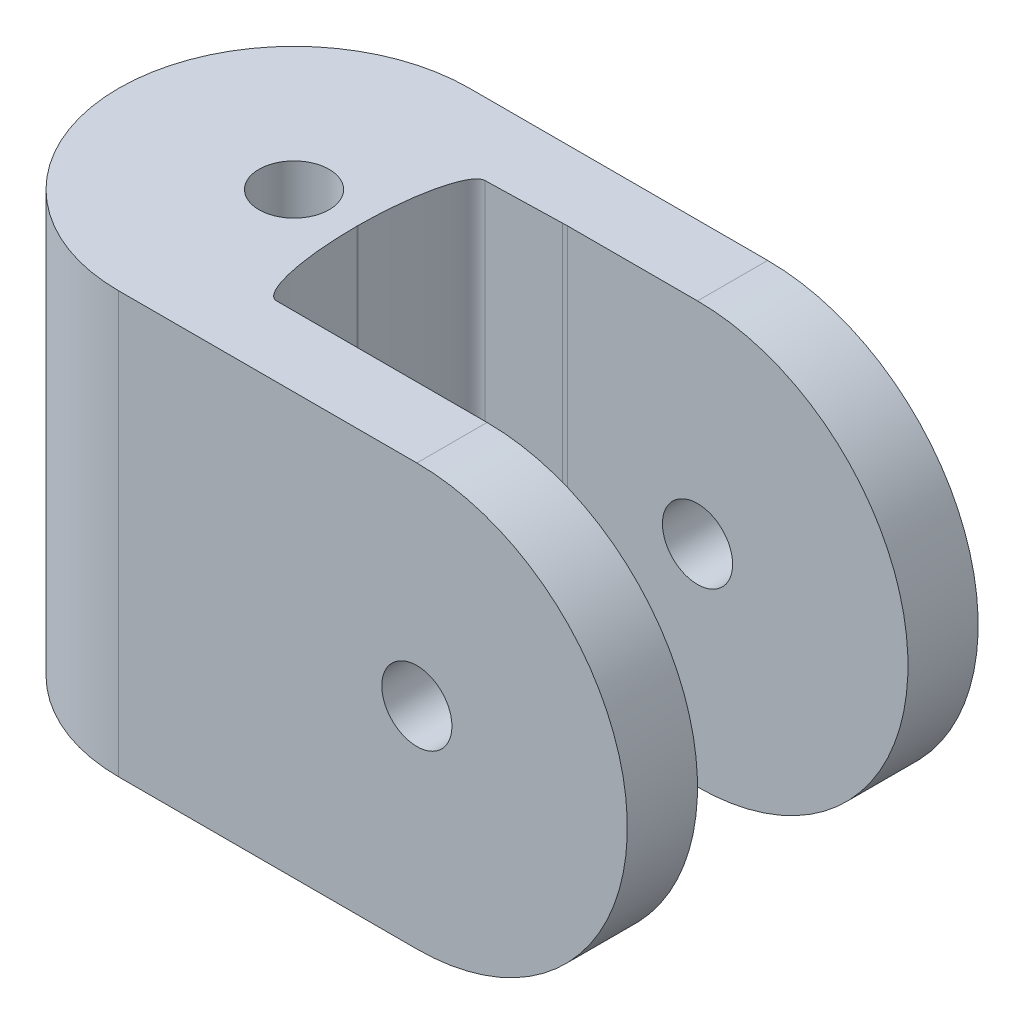
ISO-10303-21;
HEADER;
FILE_DESCRIPTION(('STEP AP214'),'2;1');
FILE_NAME('part.step','',(''),(''),'','','');
FILE_SCHEMA(('AUTOMOTIVE_DESIGN { 1 0 10303 214 1 1 1 1 }'));
ENDSEC;
DATA;
#1=APPLICATION_CONTEXT('core data for automotive mechanical design processes');
#2=APPLICATION_PROTOCOL_DEFINITION('international standard','automotive_design',2000,#1);
#3=PRODUCT_CONTEXT('',#1,'mechanical');
#4=PRODUCT('Part','Part','',(#3));
#5=PRODUCT_RELATED_PRODUCT_CATEGORY('part','',(#4));
#6=PRODUCT_DEFINITION_FORMATION('','',#4);
#7=PRODUCT_DEFINITION_CONTEXT('part definition',#1,'design');
#8=PRODUCT_DEFINITION('design','',#6,#7);
#9=PRODUCT_DEFINITION_SHAPE('','',#8);
#10=(LENGTH_UNIT() NAMED_UNIT(*) SI_UNIT(.MILLI.,.METRE.));
#11=(NAMED_UNIT(*) PLANE_ANGLE_UNIT() SI_UNIT($,.RADIAN.));
#12=(NAMED_UNIT(*) SI_UNIT($,.STERADIAN.) SOLID_ANGLE_UNIT());
#13=UNCERTAINTY_MEASURE_WITH_UNIT(LENGTH_MEASURE(1.E-05),#10,'distance_accuracy_value','');
#14=(GEOMETRIC_REPRESENTATION_CONTEXT(3) GLOBAL_UNCERTAINTY_ASSIGNED_CONTEXT((#13)) GLOBAL_UNIT_ASSIGNED_CONTEXT((#10,
#11,#12)) REPRESENTATION_CONTEXT('',''));
#15=CARTESIAN_POINT('',(0.,0.,0.));
#16=DIRECTION('',(0.,0.,1.));
#17=DIRECTION('',(1.,0.,0.));
#18=AXIS2_PLACEMENT_3D('',#15,#16,#17);
#19=CARTESIAN_POINT('',(0.,300.,0.));
#20=DIRECTION('',(0.,1.,0.));
#21=DIRECTION('',(0.,0.,1.));
#22=AXIS2_PLACEMENT_3D('',#19,#20,#21);
#23=PLANE('',#22);
#24=DIRECTION('',(0.999687564135415,0.,-0.0249954818517274));
#25=VECTOR('',#24,1.);
#26=CARTESIAN_POINT('',(-1.79910253394582,300.,-71.9546212575157));
#27=LINE('',#26,#25);
#28=CARTESIAN_POINT('',(62.5,300.,-73.5623106077974));
#29=VERTEX_POINT('',#28);
#30=CARTESIAN_POINT('',(116.251849144988,300.,-74.90628388305));
#31=VERTEX_POINT('',#30);
#32=EDGE_CURVE('E138',#29,#31,#27,.T.);
#33=ORIENTED_EDGE('',*,*,#32,.T.);
#34=CARTESIAN_POINT('',(120.,300.,0.));
#35=DIRECTION('',(0.,1.,0.));
#36=DIRECTION('',(0.,0.,1.));
#37=AXIS2_PLACEMENT_3D('',#34,#35,#36);
#38=CIRCLE('',#37,75.);
#39=CARTESIAN_POINT('',(120.,300.,-75.));
#40=VERTEX_POINT('',#39);
#41=EDGE_CURVE('E215',#40,#31,#38,.T.);
#42=ORIENTED_EDGE('',*,*,#41,.F.);
#43=DIRECTION('',(1.,0.,0.));
#44=VECTOR('',#43,1.);
#45=CARTESIAN_POINT('',(0.,300.,-75.));
#46=LINE('',#45,#44);
#47=CARTESIAN_POINT('',(212.5,300.,-75.));
#48=VERTEX_POINT('',#47);
#49=EDGE_CURVE('E63',#40,#48,#46,.T.);
#50=ORIENTED_EDGE('',*,*,#49,.T.);
#51=DIRECTION('',(0.,0.,-1.));
#52=VECTOR('',#51,1.);
#53=CARTESIAN_POINT('',(212.5,300.,125.));
#54=LINE('',#53,#52);
#55=CARTESIAN_POINT('',(212.5,300.,-125.));
#56=VERTEX_POINT('',#55);
#57=EDGE_CURVE('E252',#48,#56,#54,.T.);
#58=ORIENTED_EDGE('',*,*,#57,.T.);
#59=DIRECTION('',(-1.,0.,0.));
#60=VECTOR('',#59,1.);
#61=CARTESIAN_POINT('',(0.,300.,-125.));
#62=LINE('',#61,#60);
#63=CARTESIAN_POINT('',(0.,300.,-125.));
#64=VERTEX_POINT('',#63);
#65=EDGE_CURVE('E236',#56,#64,#62,.T.);
#66=ORIENTED_EDGE('',*,*,#65,.T.);
#67=CARTESIAN_POINT('',(0.,300.,0.));
#68=DIRECTION('',(0.,1.,0.));
#69=DIRECTION('',(0.,0.,1.));
#70=AXIS2_PLACEMENT_3D('',#67,#68,#69);
#71=CIRCLE('',#70,125.);
#72=CARTESIAN_POINT('',(0.,300.,125.));
#73=VERTEX_POINT('',#72);
#74=EDGE_CURVE('E275',#64,#73,#71,.T.);
#75=ORIENTED_EDGE('',*,*,#74,.T.);
#76=DIRECTION('',(-1.,0.,0.));
#77=VECTOR('',#76,1.);
#78=CARTESIAN_POINT('',(0.,300.,125.));
#79=LINE('',#78,#77);
#80=CARTESIAN_POINT('',(212.5,300.,125.));
#81=VERTEX_POINT('',#80);
#82=EDGE_CURVE('E241',#81,#73,#79,.T.);
#83=ORIENTED_EDGE('',*,*,#82,.F.);
#84=CARTESIAN_POINT('',(212.5,300.,75.));
#85=VERTEX_POINT('',#84);
#86=EDGE_CURVE('E263',#81,#85,#54,.T.);
#87=ORIENTED_EDGE('',*,*,#86,.T.);
#88=DIRECTION('',(1.,0.,0.));
#89=VECTOR('',#88,1.);
#90=CARTESIAN_POINT('',(0.,300.,75.));
#91=LINE('',#90,#89);
#92=CARTESIAN_POINT('',(62.5,300.,75.));
#93=VERTEX_POINT('',#92);
#94=EDGE_CURVE('E225',#93,#85,#91,.T.);
#95=ORIENTED_EDGE('',*,*,#94,.F.);
#96=CARTESIAN_POINT('',(62.5,300.,0.718844696101306));
#97=DIRECTION('',(0.,1.,0.));
#98=DIRECTION('',(0.,0.,-1.));
#99=AXIS2_PLACEMENT_3D('',#96,#97,#98);
#100=ELLIPSE('',#99,74.2811553038987,17.5);
#101=CARTESIAN_POINT('',(45.0003702385584,300.,0.235660023501613));
#102=VERTEX_POINT('',#101);
#103=EDGE_CURVE('E144',#102,#93,#100,.T.);
#104=ORIENTED_EDGE('',*,*,#103,.F.);
#105=CARTESIAN_POINT('',(45.0031230143401,300.,-0.684428519130285));
#106=VERTEX_POINT('',#105);
#107=EDGE_CURVE('E150',#106,#102,#38,.T.);
#108=ORIENTED_EDGE('',*,*,#107,.F.);
#109=EDGE_CURVE('E55',#29,#106,#100,.T.);
#110=ORIENTED_EDGE('',*,*,#109,.F.);
#111=EDGE_LOOP('',(#33,#42,#50,#58,#66,#75,#83,#87,#95,#104,#108,#110));
#112=FACE_BOUND('',#111,.T.);
#113=CARTESIAN_POINT('',(0.,300.,0.));
#114=DIRECTION('',(0.,1.,0.));
#115=DIRECTION('',(0.,0.,1.));
#116=AXIS2_PLACEMENT_3D('',#113,#114,#115);
#117=CIRCLE('',#116,25.);
#118=CARTESIAN_POINT('',(0.,300.,25.));
#119=VERTEX_POINT('',#118);
#120=EDGE_CURVE('E270',#119,#119,#117,.T.);
#121=ORIENTED_EDGE('',*,*,#120,.F.);
#122=EDGE_LOOP('',(#121));
#123=FACE_BOUND('',#122,.T.);
#124=ADVANCED_FACE('F38',(#112,#123),#23,.T.);
#125=CARTESIAN_POINT('',(0.,0.,0.));
#126=DIRECTION('',(0.,1.,0.));
#127=DIRECTION('',(0.,0.,1.));
#128=AXIS2_PLACEMENT_3D('',#125,#126,#127);
#129=PLANE('',#128);
#130=CARTESIAN_POINT('',(0.,0.,0.));
#131=DIRECTION('',(0.,1.,0.));
#132=DIRECTION('',(0.,0.,1.));
#133=AXIS2_PLACEMENT_3D('',#130,#131,#132);
#134=CIRCLE('',#133,25.);
#135=CARTESIAN_POINT('',(0.,0.,25.));
#136=VERTEX_POINT('',#135);
#137=EDGE_CURVE('E205',#136,#136,#134,.T.);
#138=ORIENTED_EDGE('',*,*,#137,.T.);
#139=EDGE_LOOP('',(#138));
#140=FACE_BOUND('',#139,.T.);
#141=CARTESIAN_POINT('',(120.,0.,0.));
#142=DIRECTION('',(0.,1.,0.));
#143=DIRECTION('',(0.,0.,1.));
#144=AXIS2_PLACEMENT_3D('',#141,#142,#143);
#145=CIRCLE('',#144,75.);
#146=CARTESIAN_POINT('',(120.,0.,-75.));
#147=VERTEX_POINT('',#146);
#148=CARTESIAN_POINT('',(116.251849144987,0.,-74.90628388305));
#149=VERTEX_POINT('',#148);
#150=EDGE_CURVE('E208',#147,#149,#145,.T.);
#151=ORIENTED_EDGE('',*,*,#150,.T.);
#152=DIRECTION('',(-0.999687564135415,0.,0.0249954818517274));
#153=VECTOR('',#152,1.);
#154=CARTESIAN_POINT('',(-1.79910253394582,0.,-71.9546212575157));
#155=LINE('',#154,#153);
#156=CARTESIAN_POINT('',(62.5,0.,-73.5623106077974));
#157=VERTEX_POINT('',#156);
#158=EDGE_CURVE('E209',#149,#157,#155,.T.);
#159=ORIENTED_EDGE('',*,*,#158,.T.);
#160=CARTESIAN_POINT('',(62.5,0.,0.718844696101306));
#161=DIRECTION('',(0.,1.,0.));
#162=DIRECTION('',(0.,0.,-1.));
#163=AXIS2_PLACEMENT_3D('',#160,#161,#162);
#164=ELLIPSE('',#163,74.2811553038987,17.5);
#165=CARTESIAN_POINT('',(45.0031230143401,0.,-0.684428519130281));
#166=VERTEX_POINT('',#165);
#167=EDGE_CURVE('E131',#166,#157,#164,.F.);
#168=ORIENTED_EDGE('',*,*,#167,.F.);
#169=CARTESIAN_POINT('',(45.0003702385583,0.,0.235660023501639));
#170=VERTEX_POINT('',#169);
#171=EDGE_CURVE('E213',#166,#170,#145,.T.);
#172=ORIENTED_EDGE('',*,*,#171,.T.);
#173=CARTESIAN_POINT('',(62.5,0.,75.));
#174=VERTEX_POINT('',#173);
#175=EDGE_CURVE('E134',#174,#170,#164,.F.);
#176=ORIENTED_EDGE('',*,*,#175,.F.);
#177=DIRECTION('',(1.,0.,0.));
#178=VECTOR('',#177,1.);
#179=CARTESIAN_POINT('',(0.,0.,75.));
#180=LINE('',#179,#178);
#181=CARTESIAN_POINT('',(212.5,0.,75.));
#182=VERTEX_POINT('',#181);
#183=EDGE_CURVE('E222',#174,#182,#180,.T.);
#184=ORIENTED_EDGE('',*,*,#183,.T.);
#185=DIRECTION('',(0.,0.,-1.));
#186=VECTOR('',#185,1.);
#187=CARTESIAN_POINT('',(212.5,0.,125.));
#188=LINE('',#187,#186);
#189=CARTESIAN_POINT('',(212.5,0.,125.));
#190=VERTEX_POINT('',#189);
#191=EDGE_CURVE('E267',#190,#182,#188,.T.);
#192=ORIENTED_EDGE('',*,*,#191,.F.);
#193=DIRECTION('',(1.,0.,0.));
#194=VECTOR('',#193,1.);
#195=CARTESIAN_POINT('',(0.,0.,125.));
#196=LINE('',#195,#194);
#197=CARTESIAN_POINT('',(0.,0.,125.));
#198=VERTEX_POINT('',#197);
#199=EDGE_CURVE('E248',#198,#190,#196,.T.);
#200=ORIENTED_EDGE('',*,*,#199,.F.);
#201=CARTESIAN_POINT('',(0.,0.,0.));
#202=DIRECTION('',(0.,1.,0.));
#203=DIRECTION('',(0.,0.,1.));
#204=AXIS2_PLACEMENT_3D('',#201,#202,#203);
#205=CIRCLE('',#204,125.);
#206=CARTESIAN_POINT('',(0.,0.,-125.));
#207=VERTEX_POINT('',#206);
#208=EDGE_CURVE('E273',#207,#198,#205,.T.);
#209=ORIENTED_EDGE('',*,*,#208,.F.);
#210=DIRECTION('',(1.,0.,0.));
#211=VECTOR('',#210,1.);
#212=CARTESIAN_POINT('',(0.,0.,-125.));
#213=LINE('',#212,#211);
#214=CARTESIAN_POINT('',(212.5,0.,-125.));
#215=VERTEX_POINT('',#214);
#216=EDGE_CURVE('E258',#207,#215,#213,.T.);
#217=ORIENTED_EDGE('',*,*,#216,.T.);
#218=CARTESIAN_POINT('',(212.5,0.,-75.));
#219=VERTEX_POINT('',#218);
#220=EDGE_CURVE('E266',#219,#215,#188,.T.);
#221=ORIENTED_EDGE('',*,*,#220,.F.);
#222=DIRECTION('',(1.,0.,0.));
#223=VECTOR('',#222,1.);
#224=CARTESIAN_POINT('',(0.,0.,-75.));
#225=LINE('',#224,#223);
#226=EDGE_CURVE('E211',#147,#219,#225,.T.);
#227=ORIENTED_EDGE('',*,*,#226,.F.);
#228=EDGE_LOOP('',(#151,#159,#168,#172,#176,#184,#192,#200,#209,#217,#221,#227));
#229=FACE_BOUND('',#228,.T.);
#230=ADVANCED_FACE('F166',(#140,#229),#129,.F.);
#231=CARTESIAN_POINT('',(120.,300.,0.));
#232=DIRECTION('',(0.,-1.,0.));
#233=DIRECTION('',(0.,0.,-1.));
#234=AXIS2_PLACEMENT_3D('',#231,#232,#233);
#235=CYLINDRICAL_SURFACE('',#234,75.);
#236=ORIENTED_EDGE('',*,*,#171,.F.);
#237=DIRECTION('',(0.,-1.,0.));
#238=VECTOR('',#237,1.);
#239=CARTESIAN_POINT('',(45.0031230143401,300.,-0.684428519130283));
#240=LINE('',#239,#238);
#241=EDGE_CURVE('E47',#166,#106,#240,.F.);
#242=ORIENTED_EDGE('',*,*,#241,.T.);
#243=ORIENTED_EDGE('',*,*,#107,.T.);
#244=DIRECTION('',(0.,-1.,0.));
#245=VECTOR('',#244,1.);
#246=CARTESIAN_POINT('',(45.0003702385584,300.,0.235660023501608));
#247=LINE('',#246,#245);
#248=EDGE_CURVE('E278',#102,#170,#247,.T.);
#249=ORIENTED_EDGE('',*,*,#248,.T.);
#250=EDGE_LOOP('',(#236,#242,#243,#249));
#251=FACE_BOUND('',#250,.T.);
#252=ADVANCED_FACE('F162',(#251),#235,.F.);
#253=DIRECTION('',(0.,-1.,0.));
#254=VECTOR('',#253,1.);
#255=CARTESIAN_POINT('',(116.251849144987,300.,-74.90628388305));
#256=LINE('',#255,#254);
#257=EDGE_CURVE('E11',#149,#31,#256,.F.);
#258=ORIENTED_EDGE('',*,*,#257,.F.);
#259=ORIENTED_EDGE('',*,*,#150,.F.);
#260=DIRECTION('',(0.,-1.,0.));
#261=VECTOR('',#260,1.);
#262=CARTESIAN_POINT('',(120.,300.,-75.));
#263=LINE('',#262,#261);
#264=EDGE_CURVE('E220',#40,#147,#263,.T.);
#265=ORIENTED_EDGE('',*,*,#264,.F.);
#266=ORIENTED_EDGE('',*,*,#41,.T.);
#267=EDGE_LOOP('',(#258,#259,#265,#266));
#268=FACE_BOUND('',#267,.T.);
#269=ADVANCED_FACE('F165',(#268),#235,.F.);
#270=CARTESIAN_POINT('',(212.5,150.,125.));
#271=DIRECTION('',(0.,0.,-1.));
#272=DIRECTION('',(-1.,0.,0.));
#273=AXIS2_PLACEMENT_3D('',#270,#271,#272);
#274=CYLINDRICAL_SURFACE('',#273,150.);
#275=CARTESIAN_POINT('',(212.5,150.,-75.));
#276=DIRECTION('',(0.,0.,1.));
#277=DIRECTION('',(1.,0.,0.));
#278=AXIS2_PLACEMENT_3D('',#275,#276,#277);
#279=CIRCLE('',#278,150.);
#280=EDGE_CURVE('E224',#219,#48,#279,.T.);
#281=ORIENTED_EDGE('',*,*,#280,.F.);
#282=ORIENTED_EDGE('',*,*,#220,.T.);
#283=CARTESIAN_POINT('',(212.5,150.,-125.));
#284=DIRECTION('',(0.,0.,1.));
#285=DIRECTION('',(1.,0.,0.));
#286=AXIS2_PLACEMENT_3D('',#283,#284,#285);
#287=CIRCLE('',#286,150.);
#288=EDGE_CURVE('E245',#215,#56,#287,.T.);
#289=ORIENTED_EDGE('',*,*,#288,.T.);
#290=ORIENTED_EDGE('',*,*,#57,.F.);
#291=EDGE_LOOP('',(#281,#282,#289,#290));
#292=FACE_BOUND('',#291,.T.);
#293=ADVANCED_FACE('F193',(#292),#274,.T.);
#294=CARTESIAN_POINT('',(212.5,150.,125.));
#295=DIRECTION('',(0.,0.,-1.));
#296=DIRECTION('',(-1.,0.,0.));
#297=AXIS2_PLACEMENT_3D('',#294,#295,#296);
#298=CYLINDRICAL_SURFACE('',#297,25.);
#299=CARTESIAN_POINT('',(212.5,150.,-125.));
#300=DIRECTION('',(0.,0.,1.));
#301=DIRECTION('',(1.,0.,0.));
#302=AXIS2_PLACEMENT_3D('',#299,#300,#301);
#303=CIRCLE('',#302,25.);
#304=CARTESIAN_POINT('',(237.5,150.,-125.));
#305=VERTEX_POINT('',#304);
#306=EDGE_CURVE('E237',#305,#305,#303,.T.);
#307=ORIENTED_EDGE('',*,*,#306,.F.);
#308=EDGE_LOOP('',(#307));
#309=FACE_BOUND('',#308,.T.);
#310=CARTESIAN_POINT('',(212.5,150.,-75.));
#311=DIRECTION('',(0.,0.,1.));
#312=DIRECTION('',(1.,0.,0.));
#313=AXIS2_PLACEMENT_3D('',#310,#311,#312);
#314=CIRCLE('',#313,25.);
#315=CARTESIAN_POINT('',(237.5,150.,-75.));
#316=VERTEX_POINT('',#315);
#317=EDGE_CURVE('E240',#316,#316,#314,.T.);
#318=ORIENTED_EDGE('',*,*,#317,.T.);
#319=EDGE_LOOP('',(#318));
#320=FACE_BOUND('',#319,.T.);
#321=ADVANCED_FACE('F180',(#309,#320),#298,.F.);
#322=CARTESIAN_POINT('',(0.,300.,0.));
#323=DIRECTION('',(0.,-1.,0.));
#324=DIRECTION('',(0.,0.,-1.));
#325=AXIS2_PLACEMENT_3D('',#322,#323,#324);
#326=CYLINDRICAL_SURFACE('',#325,125.);
#327=DIRECTION('',(0.,-1.,0.));
#328=VECTOR('',#327,1.);
#329=CARTESIAN_POINT('',(0.,300.,125.));
#330=LINE('',#329,#328);
#331=EDGE_CURVE('E244',#73,#198,#330,.T.);
#332=ORIENTED_EDGE('',*,*,#331,.F.);
#333=ORIENTED_EDGE('',*,*,#74,.F.);
#334=DIRECTION('',(0.,-1.,0.));
#335=VECTOR('',#334,1.);
#336=CARTESIAN_POINT('',(0.,300.,-125.));
#337=LINE('',#336,#335);
#338=EDGE_CURVE('E255',#64,#207,#337,.T.);
#339=ORIENTED_EDGE('',*,*,#338,.T.);
#340=ORIENTED_EDGE('',*,*,#208,.T.);
#341=EDGE_LOOP('',(#332,#333,#339,#340));
#342=FACE_BOUND('',#341,.T.);
#343=ADVANCED_FACE('F40',(#342),#326,.T.);
#344=CARTESIAN_POINT('',(0.,300.,0.));
#345=DIRECTION('',(0.,-1.,0.));
#346=DIRECTION('',(0.,0.,-1.));
#347=AXIS2_PLACEMENT_3D('',#344,#345,#346);
#348=CYLINDRICAL_SURFACE('',#347,25.);
#349=ORIENTED_EDGE('',*,*,#120,.T.);
#350=EDGE_LOOP('',(#349));
#351=FACE_BOUND('',#350,.T.);
#352=ORIENTED_EDGE('',*,*,#137,.F.);
#353=EDGE_LOOP('',(#352));
#354=FACE_BOUND('',#353,.T.);
#355=ADVANCED_FACE('F185',(#351,#354),#348,.F.);
#356=CARTESIAN_POINT('',(212.5,150.,125.));
#357=DIRECTION('',(0.,0.,1.));
#358=DIRECTION('',(1.,0.,0.));
#359=AXIS2_PLACEMENT_3D('',#356,#357,#358);
#360=PLANE('',#359);
#361=ORIENTED_EDGE('',*,*,#82,.T.);
#362=ORIENTED_EDGE('',*,*,#331,.T.);
#363=ORIENTED_EDGE('',*,*,#199,.T.);
#364=CARTESIAN_POINT('',(212.5,150.,125.));
#365=DIRECTION('',(0.,0.,1.));
#366=DIRECTION('',(1.,0.,0.));
#367=AXIS2_PLACEMENT_3D('',#364,#365,#366);
#368=CIRCLE('',#367,150.);
#369=EDGE_CURVE('E250',#190,#81,#368,.T.);
#370=ORIENTED_EDGE('',*,*,#369,.T.);
#371=EDGE_LOOP('',(#361,#362,#363,#370));
#372=FACE_BOUND('',#371,.T.);
#373=CARTESIAN_POINT('',(212.5,150.,125.));
#374=DIRECTION('',(0.,0.,1.));
#375=DIRECTION('',(1.,0.,0.));
#376=AXIS2_PLACEMENT_3D('',#373,#374,#375);
#377=CIRCLE('',#376,25.);
#378=CARTESIAN_POINT('',(237.5,150.,125.));
#379=VERTEX_POINT('',#378);
#380=EDGE_CURVE('E233',#379,#379,#377,.T.);
#381=ORIENTED_EDGE('',*,*,#380,.F.);
#382=EDGE_LOOP('',(#381));
#383=FACE_BOUND('',#382,.T.);
#384=ADVANCED_FACE('F181',(#372,#383),#360,.T.);
#385=CARTESIAN_POINT('',(212.5,150.,-125.));
#386=DIRECTION('',(0.,0.,1.));
#387=DIRECTION('',(1.,0.,0.));
#388=AXIS2_PLACEMENT_3D('',#385,#386,#387);
#389=PLANE('',#388);
#390=ORIENTED_EDGE('',*,*,#65,.F.);
#391=ORIENTED_EDGE('',*,*,#288,.F.);
#392=ORIENTED_EDGE('',*,*,#216,.F.);
#393=ORIENTED_EDGE('',*,*,#338,.F.);
#394=EDGE_LOOP('',(#390,#391,#392,#393));
#395=FACE_BOUND('',#394,.T.);
#396=ORIENTED_EDGE('',*,*,#306,.T.);
#397=EDGE_LOOP('',(#396));
#398=FACE_BOUND('',#397,.T.);
#399=ADVANCED_FACE('F184',(#395,#398),#389,.F.);
#400=ORIENTED_EDGE('',*,*,#191,.T.);
#401=CARTESIAN_POINT('',(212.5,150.,75.));
#402=DIRECTION('',(0.,0.,1.));
#403=DIRECTION('',(1.,0.,0.));
#404=AXIS2_PLACEMENT_3D('',#401,#402,#403);
#405=CIRCLE('',#404,150.);
#406=EDGE_CURVE('E229',#182,#85,#405,.T.);
#407=ORIENTED_EDGE('',*,*,#406,.T.);
#408=ORIENTED_EDGE('',*,*,#86,.F.);
#409=ORIENTED_EDGE('',*,*,#369,.F.);
#410=EDGE_LOOP('',(#400,#407,#408,#409));
#411=FACE_BOUND('',#410,.T.);
#412=ADVANCED_FACE('F178',(#411),#274,.T.);
#413=CARTESIAN_POINT('',(212.5,150.,75.));
#414=DIRECTION('',(0.,0.,1.));
#415=DIRECTION('',(1.,0.,0.));
#416=AXIS2_PLACEMENT_3D('',#413,#414,#415);
#417=CIRCLE('',#416,25.);
#418=CARTESIAN_POINT('',(237.5,150.,75.));
#419=VERTEX_POINT('',#418);
#420=EDGE_CURVE('E228',#419,#419,#417,.T.);
#421=ORIENTED_EDGE('',*,*,#420,.F.);
#422=EDGE_LOOP('',(#421));
#423=FACE_BOUND('',#422,.T.);
#424=ORIENTED_EDGE('',*,*,#380,.T.);
#425=EDGE_LOOP('',(#424));
#426=FACE_BOUND('',#425,.T.);
#427=ADVANCED_FACE('F172',(#423,#426),#298,.F.);
#428=CARTESIAN_POINT('',(0.,0.,-75.));
#429=DIRECTION('',(0.,0.,1.));
#430=DIRECTION('',(1.,0.,0.));
#431=AXIS2_PLACEMENT_3D('',#428,#429,#430);
#432=PLANE('',#431);
#433=ORIENTED_EDGE('',*,*,#264,.T.);
#434=ORIENTED_EDGE('',*,*,#226,.T.);
#435=ORIENTED_EDGE('',*,*,#280,.T.);
#436=ORIENTED_EDGE('',*,*,#49,.F.);
#437=EDGE_LOOP('',(#433,#434,#435,#436));
#438=FACE_BOUND('',#437,.T.);
#439=ORIENTED_EDGE('',*,*,#317,.F.);
#440=EDGE_LOOP('',(#439));
#441=FACE_BOUND('',#440,.T.);
#442=ADVANCED_FACE('F168',(#438,#441),#432,.T.);
#443=CARTESIAN_POINT('',(0.,0.,75.));
#444=DIRECTION('',(0.,0.,1.));
#445=DIRECTION('',(1.,0.,0.));
#446=AXIS2_PLACEMENT_3D('',#443,#444,#445);
#447=PLANE('',#446);
#448=ORIENTED_EDGE('',*,*,#420,.T.);
#449=EDGE_LOOP('',(#448));
#450=FACE_BOUND('',#449,.T.);
#451=ORIENTED_EDGE('',*,*,#183,.F.);
#452=DIRECTION('',(0.,-1.,0.));
#453=VECTOR('',#452,1.);
#454=CARTESIAN_POINT('',(62.5,300.,75.));
#455=LINE('',#454,#453);
#456=EDGE_CURVE('E135',#93,#174,#455,.T.);
#457=ORIENTED_EDGE('',*,*,#456,.F.);
#458=ORIENTED_EDGE('',*,*,#94,.T.);
#459=ORIENTED_EDGE('',*,*,#406,.F.);
#460=EDGE_LOOP('',(#451,#457,#458,#459));
#461=FACE_BOUND('',#460,.T.);
#462=ADVANCED_FACE('F171',(#450,#461),#447,.F.);
#463=DIRECTION('',(0.,-1.,0.));
#464=VECTOR('',#463,1.);
#465=SURFACE_OF_LINEAR_EXTRUSION('',#100,#464);
#466=ORIENTED_EDGE('',*,*,#175,.T.);
#467=ORIENTED_EDGE('',*,*,#248,.F.);
#468=ORIENTED_EDGE('',*,*,#103,.T.);
#469=ORIENTED_EDGE('',*,*,#456,.T.);
#470=EDGE_LOOP('',(#466,#467,#468,#469));
#471=FACE_BOUND('',#470,.T.);
#472=ADVANCED_FACE('F159',(#471),#465,.T.);
#473=CARTESIAN_POINT('',(-1.79910253394582,300.,-71.9546212575157));
#474=DIRECTION('',(-0.0249954818517274,0.,-0.999687564135415));
#475=DIRECTION('',(-0.999687564135415,0.,0.0249954818517274));
#476=AXIS2_PLACEMENT_3D('',#473,#474,#475);
#477=PLANE('',#476);
#478=ORIENTED_EDGE('',*,*,#257,.T.);
#479=ORIENTED_EDGE('',*,*,#32,.F.);
#480=DIRECTION('',(0.,-1.,0.));
#481=VECTOR('',#480,1.);
#482=CARTESIAN_POINT('',(62.5,300.,-73.5623106077974));
#483=LINE('',#482,#481);
#484=EDGE_CURVE('E127',#29,#157,#483,.T.);
#485=ORIENTED_EDGE('',*,*,#484,.T.);
#486=ORIENTED_EDGE('',*,*,#158,.F.);
#487=EDGE_LOOP('',(#478,#479,#485,#486));
#488=FACE_BOUND('',#487,.T.);
#489=ADVANCED_FACE('F139',(#488),#477,.F.);
#490=ORIENTED_EDGE('',*,*,#167,.T.);
#491=ORIENTED_EDGE('',*,*,#484,.F.);
#492=ORIENTED_EDGE('',*,*,#109,.T.);
#493=ORIENTED_EDGE('',*,*,#241,.F.);
#494=EDGE_LOOP('',(#490,#491,#492,#493));
#495=FACE_BOUND('',#494,.T.);
#496=ADVANCED_FACE('F129',(#495),#465,.T.);
#497=CLOSED_SHELL('',(#124,#230,#252,#269,#293,#321,#343,#355,#384,#399,#412,#427,#442,#462,
#472,#489,#496));
#498=MANIFOLD_SOLID_BREP('B2',#497);
#499=ADVANCED_BREP_SHAPE_REPRESENTATION('',(#18,#498),#14);
#500=SHAPE_DEFINITION_REPRESENTATION(#9,#499);
ENDSEC;
END-ISO-10303-21;
